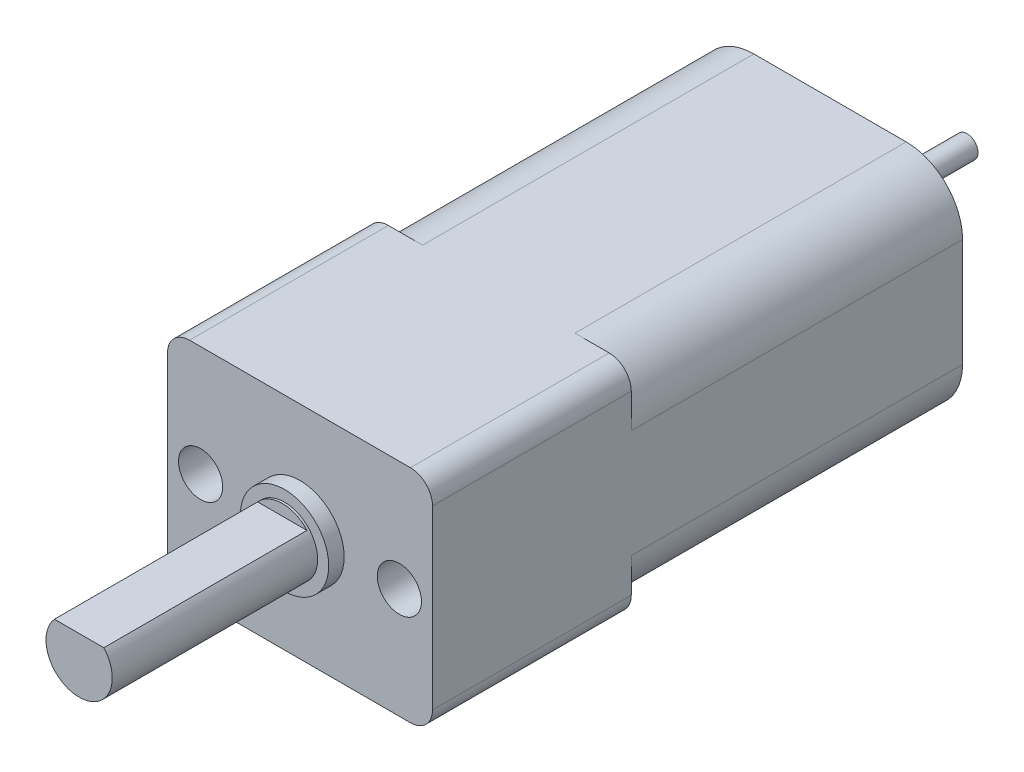
ISO-10303-21;
HEADER;
FILE_DESCRIPTION(('STEP AP214'),'2;1');
FILE_NAME('part.step','',(''),(''),'','','');
FILE_SCHEMA(('AUTOMOTIVE_DESIGN { 1 0 10303 214 1 1 1 1 }'));
ENDSEC;
DATA;
#1=APPLICATION_CONTEXT('core data for automotive mechanical design processes');
#2=APPLICATION_PROTOCOL_DEFINITION('international standard','automotive_design',2000,#1);
#3=PRODUCT_CONTEXT('',#1,'mechanical');
#4=PRODUCT('Part','Part','',(#3));
#5=PRODUCT_RELATED_PRODUCT_CATEGORY('part','',(#4));
#6=PRODUCT_DEFINITION_FORMATION('','',#4);
#7=PRODUCT_DEFINITION_CONTEXT('part definition',#1,'design');
#8=PRODUCT_DEFINITION('design','',#6,#7);
#9=PRODUCT_DEFINITION_SHAPE('','',#8);
#10=(LENGTH_UNIT() NAMED_UNIT(*) SI_UNIT(.MILLI.,.METRE.));
#11=(NAMED_UNIT(*) PLANE_ANGLE_UNIT() SI_UNIT($,.RADIAN.));
#12=(NAMED_UNIT(*) SI_UNIT($,.STERADIAN.) SOLID_ANGLE_UNIT());
#13=UNCERTAINTY_MEASURE_WITH_UNIT(LENGTH_MEASURE(1.E-05),#10,'distance_accuracy_value','');
#14=(GEOMETRIC_REPRESENTATION_CONTEXT(3) GLOBAL_UNCERTAINTY_ASSIGNED_CONTEXT((#13)) GLOBAL_UNIT_ASSIGNED_CONTEXT((#10,
#11,#12)) REPRESENTATION_CONTEXT('',''));
#15=CARTESIAN_POINT('',(0.,0.,0.));
#16=DIRECTION('',(0.,0.,1.));
#17=DIRECTION('',(1.,0.,0.));
#18=AXIS2_PLACEMENT_3D('',#15,#16,#17);
#19=CARTESIAN_POINT('',(0.,0.,-1.2));
#20=DIRECTION('',(0.,0.,-1.));
#21=DIRECTION('',(-1.,0.,0.));
#22=AXIS2_PLACEMENT_3D('',#19,#20,#21);
#23=PLANE('',#22);
#24=CARTESIAN_POINT('',(0.,0.,-1.2));
#25=DIRECTION('',(0.,0.,-1.));
#26=DIRECTION('',(-1.,0.,0.));
#27=AXIS2_PLACEMENT_3D('',#24,#25,#26);
#28=CIRCLE('',#27,2.5);
#29=CARTESIAN_POINT('',(-2.5,0.,-1.2));
#30=VERTEX_POINT('',#29);
#31=EDGE_CURVE('E266',#30,#30,#28,.T.);
#32=ORIENTED_EDGE('',*,*,#31,.T.);
#33=EDGE_LOOP('',(#32));
#34=FACE_BOUND('',#33,.T.);
#35=CARTESIAN_POINT('',(0.,0.,-1.2));
#36=DIRECTION('',(0.,0.,-1.));
#37=DIRECTION('',(-1.,0.,0.));
#38=AXIS2_PLACEMENT_3D('',#35,#36,#37);
#39=CIRCLE('',#38,0.5);
#40=CARTESIAN_POINT('',(-0.5,0.,-1.2));
#41=VERTEX_POINT('',#40);
#42=EDGE_CURVE('E273',#41,#41,#39,.T.);
#43=ORIENTED_EDGE('',*,*,#42,.F.);
#44=EDGE_LOOP('',(#43));
#45=FACE_BOUND('',#44,.T.);
#46=ADVANCED_FACE('F37',(#34,#45),#23,.T.);
#47=CARTESIAN_POINT('',(3.45,2.45,0.));
#48=DIRECTION('',(0.,0.,-1.));
#49=DIRECTION('',(-1.,0.,0.));
#50=AXIS2_PLACEMENT_3D('',#47,#48,#49);
#51=PLANE('',#50);
#52=CARTESIAN_POINT('',(3.45,2.45,0.));
#53=DIRECTION('',(0.,0.,1.));
#54=DIRECTION('',(-1.,0.,0.));
#55=AXIS2_PLACEMENT_3D('',#52,#53,#54);
#56=CIRCLE('',#55,2.55);
#57=CARTESIAN_POINT('',(6.,2.44999999999998,0.));
#58=VERTEX_POINT('',#57);
#59=CARTESIAN_POINT('',(3.44999999999998,5.,0.));
#60=VERTEX_POINT('',#59);
#61=EDGE_CURVE('E195',#58,#60,#56,.T.);
#62=ORIENTED_EDGE('',*,*,#61,.F.);
#63=DIRECTION('',(0.,1.,0.));
#64=VECTOR('',#63,1.);
#65=CARTESIAN_POINT('',(6.,-2.44999999999998,0.));
#66=LINE('',#65,#64);
#67=CARTESIAN_POINT('',(6.,-2.44999999999998,0.));
#68=VERTEX_POINT('',#67);
#69=EDGE_CURVE('E93',#68,#58,#66,.T.);
#70=ORIENTED_EDGE('',*,*,#69,.F.);
#71=CARTESIAN_POINT('',(3.45,-2.45,0.));
#72=DIRECTION('',(0.,0.,1.));
#73=DIRECTION('',(-1.,0.,0.));
#74=AXIS2_PLACEMENT_3D('',#71,#72,#73);
#75=CIRCLE('',#74,2.55);
#76=CARTESIAN_POINT('',(3.44999999999999,-5.,0.));
#77=VERTEX_POINT('',#76);
#78=EDGE_CURVE('E651',#77,#68,#75,.T.);
#79=ORIENTED_EDGE('',*,*,#78,.F.);
#80=DIRECTION('',(1.,0.,0.));
#81=VECTOR('',#80,1.);
#82=CARTESIAN_POINT('',(3.44999999999999,-5.,0.));
#83=LINE('',#82,#81);
#84=CARTESIAN_POINT('',(-3.44999999999998,-5.,0.));
#85=VERTEX_POINT('',#84);
#86=EDGE_CURVE('E653',#85,#77,#83,.T.);
#87=ORIENTED_EDGE('',*,*,#86,.F.);
#88=CARTESIAN_POINT('',(-3.45,-2.45,0.));
#89=DIRECTION('',(0.,0.,1.));
#90=DIRECTION('',(1.,0.,0.));
#91=AXIS2_PLACEMENT_3D('',#88,#89,#90);
#92=CIRCLE('',#91,2.55);
#93=CARTESIAN_POINT('',(-6.,-2.44999999999998,0.));
#94=VERTEX_POINT('',#93);
#95=EDGE_CURVE('E123',#94,#85,#92,.T.);
#96=ORIENTED_EDGE('',*,*,#95,.F.);
#97=DIRECTION('',(0.,-1.,0.));
#98=VECTOR('',#97,1.);
#99=CARTESIAN_POINT('',(-6.,-2.44999999999998,0.));
#100=LINE('',#99,#98);
#101=CARTESIAN_POINT('',(-6.,2.44999999999998,0.));
#102=VERTEX_POINT('',#101);
#103=EDGE_CURVE('E618',#102,#94,#100,.T.);
#104=ORIENTED_EDGE('',*,*,#103,.F.);
#105=CARTESIAN_POINT('',(-3.45,2.45,0.));
#106=DIRECTION('',(0.,0.,1.));
#107=DIRECTION('',(1.,0.,0.));
#108=AXIS2_PLACEMENT_3D('',#105,#106,#107);
#109=CIRCLE('',#108,2.55);
#110=CARTESIAN_POINT('',(-3.44999999999998,5.,0.));
#111=VERTEX_POINT('',#110);
#112=EDGE_CURVE('E657',#111,#102,#109,.T.);
#113=ORIENTED_EDGE('',*,*,#112,.F.);
#114=DIRECTION('',(-1.,0.,0.));
#115=VECTOR('',#114,1.);
#116=CARTESIAN_POINT('',(3.44999999999998,5.,0.));
#117=LINE('',#116,#115);
#118=EDGE_CURVE('E659',#60,#111,#117,.T.);
#119=ORIENTED_EDGE('',*,*,#118,.F.);
#120=EDGE_LOOP('',(#62,#70,#79,#87,#96,#104,#113,#119));
#121=FACE_BOUND('',#120,.T.);
#122=CARTESIAN_POINT('',(0.,0.,0.));
#123=DIRECTION('',(0.,0.,-1.));
#124=DIRECTION('',(-1.,0.,0.));
#125=AXIS2_PLACEMENT_3D('',#122,#123,#124);
#126=CIRCLE('',#125,2.5);
#127=CARTESIAN_POINT('',(-2.5,0.,0.));
#128=VERTEX_POINT('',#127);
#129=EDGE_CURVE('E267',#128,#128,#126,.T.);
#130=ORIENTED_EDGE('',*,*,#129,.F.);
#131=EDGE_LOOP('',(#130));
#132=FACE_BOUND('',#131,.T.);
#133=ADVANCED_FACE('F322',(#121,#132),#51,.T.);
#134=CARTESIAN_POINT('',(0.,0.,24.7));
#135=DIRECTION('',(0.,0.,1.));
#136=DIRECTION('',(1.,0.,0.));
#137=AXIS2_PLACEMENT_3D('',#134,#135,#136);
#138=PLANE('',#137);
#139=CARTESIAN_POINT('',(0.,0.,24.7));
#140=DIRECTION('',(0.,0.,1.));
#141=DIRECTION('',(1.,0.,0.));
#142=AXIS2_PLACEMENT_3D('',#139,#140,#141);
#143=CIRCLE('',#142,2.);
#144=CARTESIAN_POINT('',(2.,0.,24.7));
#145=VERTEX_POINT('',#144);
#146=EDGE_CURVE('E250',#145,#145,#143,.T.);
#147=ORIENTED_EDGE('',*,*,#146,.T.);
#148=EDGE_LOOP('',(#147));
#149=FACE_BOUND('',#148,.T.);
#150=CARTESIAN_POINT('',(0.,0.,24.7));
#151=DIRECTION('',(0.,0.,1.));
#152=DIRECTION('',(1.,0.,0.));
#153=AXIS2_PLACEMENT_3D('',#150,#151,#152);
#154=CIRCLE('',#153,1.5);
#155=CARTESIAN_POINT('',(1.5,0.,24.7));
#156=VERTEX_POINT('',#155);
#157=EDGE_CURVE('E254',#156,#156,#154,.T.);
#158=ORIENTED_EDGE('',*,*,#157,.F.);
#159=EDGE_LOOP('',(#158));
#160=FACE_BOUND('',#159,.T.);
#161=ADVANCED_FACE('F296',(#149,#160),#138,.T.);
#162=CARTESIAN_POINT('',(-5.,-4.,24.));
#163=DIRECTION('',(0.,0.,1.));
#164=DIRECTION('',(1.,0.,0.));
#165=AXIS2_PLACEMENT_3D('',#162,#163,#164);
#166=PLANE('',#165);
#167=CARTESIAN_POINT('',(-4.5,0.,24.));
#168=DIRECTION('',(0.,0.,1.));
#169=DIRECTION('',(1.,0.,0.));
#170=AXIS2_PLACEMENT_3D('',#167,#168,#169);
#171=CIRCLE('',#170,0.999999999999989);
#172=CARTESIAN_POINT('',(-3.50000000000001,0.,24.));
#173=VERTEX_POINT('',#172);
#174=EDGE_CURVE('E287',#173,#173,#171,.T.);
#175=ORIENTED_EDGE('',*,*,#174,.F.);
#176=EDGE_LOOP('',(#175));
#177=FACE_BOUND('',#176,.T.);
#178=CARTESIAN_POINT('',(4.5,0.,24.));
#179=DIRECTION('',(0.,0.,1.));
#180=DIRECTION('',(1.,0.,0.));
#181=AXIS2_PLACEMENT_3D('',#178,#179,#180);
#182=CIRCLE('',#181,0.999999999999989);
#183=CARTESIAN_POINT('',(5.49999999999999,0.,24.));
#184=VERTEX_POINT('',#183);
#185=EDGE_CURVE('E281',#184,#184,#182,.T.);
#186=ORIENTED_EDGE('',*,*,#185,.F.);
#187=EDGE_LOOP('',(#186));
#188=FACE_BOUND('',#187,.T.);
#189=CARTESIAN_POINT('',(-5.,-4.,24.));
#190=DIRECTION('',(0.,0.,1.));
#191=DIRECTION('',(1.,0.,0.));
#192=AXIS2_PLACEMENT_3D('',#189,#190,#191);
#193=CIRCLE('',#192,1.);
#194=CARTESIAN_POINT('',(-6.,-3.99999999999999,24.));
#195=VERTEX_POINT('',#194);
#196=CARTESIAN_POINT('',(-4.99999999999999,-5.,24.));
#197=VERTEX_POINT('',#196);
#198=EDGE_CURVE('E193',#195,#197,#193,.T.);
#199=ORIENTED_EDGE('',*,*,#198,.T.);
#200=DIRECTION('',(1.,0.,0.));
#201=VECTOR('',#200,1.);
#202=CARTESIAN_POINT('',(4.99999999999999,-5.,24.));
#203=LINE('',#202,#201);
#204=CARTESIAN_POINT('',(4.99999999999999,-5.,24.));
#205=VERTEX_POINT('',#204);
#206=EDGE_CURVE('E243',#197,#205,#203,.T.);
#207=ORIENTED_EDGE('',*,*,#206,.T.);
#208=CARTESIAN_POINT('',(5.,-4.,24.));
#209=DIRECTION('',(0.,0.,1.));
#210=DIRECTION('',(1.,0.,0.));
#211=AXIS2_PLACEMENT_3D('',#208,#209,#210);
#212=CIRCLE('',#211,1.);
#213=CARTESIAN_POINT('',(6.,-3.99999999999999,24.));
#214=VERTEX_POINT('',#213);
#215=EDGE_CURVE('E240',#205,#214,#212,.T.);
#216=ORIENTED_EDGE('',*,*,#215,.T.);
#217=DIRECTION('',(0.,1.,0.));
#218=VECTOR('',#217,1.);
#219=CARTESIAN_POINT('',(6.,-3.99999999999999,24.));
#220=LINE('',#219,#218);
#221=CARTESIAN_POINT('',(6.,4.,24.));
#222=VERTEX_POINT('',#221);
#223=EDGE_CURVE('E237',#214,#222,#220,.T.);
#224=ORIENTED_EDGE('',*,*,#223,.T.);
#225=CARTESIAN_POINT('',(5.,4.,24.));
#226=DIRECTION('',(0.,0.,1.));
#227=DIRECTION('',(1.,0.,0.));
#228=AXIS2_PLACEMENT_3D('',#225,#226,#227);
#229=CIRCLE('',#228,1.);
#230=CARTESIAN_POINT('',(4.99999999999999,5.,24.));
#231=VERTEX_POINT('',#230);
#232=EDGE_CURVE('E234',#222,#231,#229,.T.);
#233=ORIENTED_EDGE('',*,*,#232,.T.);
#234=DIRECTION('',(-1.,0.,0.));
#235=VECTOR('',#234,1.);
#236=CARTESIAN_POINT('',(4.99999999999999,5.,24.));
#237=LINE('',#236,#235);
#238=CARTESIAN_POINT('',(-4.99999999999999,5.,24.));
#239=VERTEX_POINT('',#238);
#240=EDGE_CURVE('E229',#231,#239,#237,.T.);
#241=ORIENTED_EDGE('',*,*,#240,.T.);
#242=CARTESIAN_POINT('',(-5.,4.,24.));
#243=DIRECTION('',(0.,0.,1.));
#244=DIRECTION('',(1.,0.,0.));
#245=AXIS2_PLACEMENT_3D('',#242,#243,#244);
#246=CIRCLE('',#245,1.);
#247=CARTESIAN_POINT('',(-6.,3.99999999999999,24.));
#248=VERTEX_POINT('',#247);
#249=EDGE_CURVE('E224',#239,#248,#246,.T.);
#250=ORIENTED_EDGE('',*,*,#249,.T.);
#251=DIRECTION('',(0.,-1.,0.));
#252=VECTOR('',#251,1.);
#253=CARTESIAN_POINT('',(-6.,-3.99999999999999,24.));
#254=LINE('',#253,#252);
#255=EDGE_CURVE('E218',#248,#195,#254,.T.);
#256=ORIENTED_EDGE('',*,*,#255,.T.);
#257=EDGE_LOOP('',(#199,#207,#216,#224,#233,#241,#250,#256));
#258=FACE_BOUND('',#257,.T.);
#259=CARTESIAN_POINT('',(0.,0.,24.));
#260=DIRECTION('',(0.,0.,1.));
#261=DIRECTION('',(1.,0.,0.));
#262=AXIS2_PLACEMENT_3D('',#259,#260,#261);
#263=CIRCLE('',#262,2.);
#264=CARTESIAN_POINT('',(2.,0.,24.));
#265=VERTEX_POINT('',#264);
#266=EDGE_CURVE('E247',#265,#265,#263,.T.);
#267=ORIENTED_EDGE('',*,*,#266,.F.);
#268=EDGE_LOOP('',(#267));
#269=FACE_BOUND('',#268,.T.);
#270=ADVANCED_FACE('F293',(#177,#188,#258,#269),#166,.T.);
#271=CARTESIAN_POINT('',(3.45,2.45,15.));
#272=DIRECTION('',(0.,0.,-1.));
#273=DIRECTION('',(-1.,0.,0.));
#274=AXIS2_PLACEMENT_3D('',#271,#272,#273);
#275=CYLINDRICAL_SURFACE('',#274,2.55);
#276=ORIENTED_EDGE('',*,*,#61,.T.);
#277=DIRECTION('',(0.,0.,-1.));
#278=VECTOR('',#277,1.);
#279=CARTESIAN_POINT('',(3.44999999999998,5.,15.));
#280=LINE('',#279,#278);
#281=CARTESIAN_POINT('',(3.44999999999998,5.,15.));
#282=VERTEX_POINT('',#281);
#283=EDGE_CURVE('E100',#282,#60,#280,.T.);
#284=ORIENTED_EDGE('',*,*,#283,.F.);
#285=CARTESIAN_POINT('',(3.45,2.45,15.));
#286=DIRECTION('',(0.,0.,1.));
#287=DIRECTION('',(-1.,0.,0.));
#288=AXIS2_PLACEMENT_3D('',#285,#286,#287);
#289=CIRCLE('',#288,2.55);
#290=CARTESIAN_POINT('',(6.,2.44999999999998,15.));
#291=VERTEX_POINT('',#290);
#292=EDGE_CURVE('E630',#291,#282,#289,.T.);
#293=ORIENTED_EDGE('',*,*,#292,.F.);
#294=DIRECTION('',(0.,0.,-1.));
#295=VECTOR('',#294,1.);
#296=CARTESIAN_POINT('',(6.,2.44999999999998,15.));
#297=LINE('',#296,#295);
#298=EDGE_CURVE('E61',#291,#58,#297,.T.);
#299=ORIENTED_EDGE('',*,*,#298,.T.);
#300=EDGE_LOOP('',(#276,#284,#293,#299));
#301=FACE_BOUND('',#300,.T.);
#302=ADVANCED_FACE('F39',(#301),#275,.T.);
#303=CARTESIAN_POINT('',(3.44999999999998,5.,15.));
#304=DIRECTION('',(0.,-1.,0.));
#305=DIRECTION('',(1.,0.,0.));
#306=AXIS2_PLACEMENT_3D('',#303,#304,#305);
#307=PLANE('',#306);
#308=ORIENTED_EDGE('',*,*,#118,.T.);
#309=DIRECTION('',(0.,0.,-1.));
#310=VECTOR('',#309,1.);
#311=CARTESIAN_POINT('',(-3.44999999999998,5.,15.));
#312=LINE('',#311,#310);
#313=CARTESIAN_POINT('',(-3.44999999999998,5.,15.));
#314=VERTEX_POINT('',#313);
#315=EDGE_CURVE('E621',#314,#111,#312,.T.);
#316=ORIENTED_EDGE('',*,*,#315,.F.);
#317=DIRECTION('',(-1.,0.,0.));
#318=VECTOR('',#317,1.);
#319=CARTESIAN_POINT('',(4.99999999999999,5.,15.));
#320=LINE('',#319,#318);
#321=CARTESIAN_POINT('',(-4.99999999999999,5.,15.));
#322=VERTEX_POINT('',#321);
#323=EDGE_CURVE('E173',#314,#322,#320,.T.);
#324=ORIENTED_EDGE('',*,*,#323,.T.);
#325=DIRECTION('',(0.,0.,-1.));
#326=VECTOR('',#325,1.);
#327=CARTESIAN_POINT('',(-4.99999999999999,5.,24.));
#328=LINE('',#327,#326);
#329=EDGE_CURVE('E208',#239,#322,#328,.T.);
#330=ORIENTED_EDGE('',*,*,#329,.F.);
#331=ORIENTED_EDGE('',*,*,#240,.F.);
#332=DIRECTION('',(0.,0.,-1.));
#333=VECTOR('',#332,1.);
#334=CARTESIAN_POINT('',(4.99999999999999,5.,24.));
#335=LINE('',#334,#333);
#336=CARTESIAN_POINT('',(4.99999999999999,5.,15.));
#337=VERTEX_POINT('',#336);
#338=EDGE_CURVE('E205',#231,#337,#335,.T.);
#339=ORIENTED_EDGE('',*,*,#338,.T.);
#340=EDGE_CURVE('E176',#337,#282,#320,.T.);
#341=ORIENTED_EDGE('',*,*,#340,.T.);
#342=ORIENTED_EDGE('',*,*,#283,.T.);
#343=EDGE_LOOP('',(#308,#316,#324,#330,#331,#339,#341,#342));
#344=FACE_BOUND('',#343,.T.);
#345=ADVANCED_FACE('F370',(#344),#307,.F.);
#346=CARTESIAN_POINT('',(-3.45,2.45,15.));
#347=DIRECTION('',(0.,0.,-1.));
#348=DIRECTION('',(-1.,0.,0.));
#349=AXIS2_PLACEMENT_3D('',#346,#347,#348);
#350=CYLINDRICAL_SURFACE('',#349,2.55);
#351=ORIENTED_EDGE('',*,*,#112,.T.);
#352=DIRECTION('',(0.,0.,-1.));
#353=VECTOR('',#352,1.);
#354=CARTESIAN_POINT('',(-6.,2.44999999999998,15.));
#355=LINE('',#354,#353);
#356=CARTESIAN_POINT('',(-6.,2.44999999999998,15.));
#357=VERTEX_POINT('',#356);
#358=EDGE_CURVE('E619',#357,#102,#355,.T.);
#359=ORIENTED_EDGE('',*,*,#358,.F.);
#360=CARTESIAN_POINT('',(-3.45,2.45,15.));
#361=DIRECTION('',(0.,0.,1.));
#362=DIRECTION('',(1.,0.,0.));
#363=AXIS2_PLACEMENT_3D('',#360,#361,#362);
#364=CIRCLE('',#363,2.55);
#365=EDGE_CURVE('E140',#314,#357,#364,.T.);
#366=ORIENTED_EDGE('',*,*,#365,.F.);
#367=ORIENTED_EDGE('',*,*,#315,.T.);
#368=EDGE_LOOP('',(#351,#359,#366,#367));
#369=FACE_BOUND('',#368,.T.);
#370=ADVANCED_FACE('F376',(#369),#350,.T.);
#371=CARTESIAN_POINT('',(-6.,-2.44999999999998,15.));
#372=DIRECTION('',(1.,0.,0.));
#373=DIRECTION('',(0.,0.,-1.));
#374=AXIS2_PLACEMENT_3D('',#371,#372,#373);
#375=PLANE('',#374);
#376=ORIENTED_EDGE('',*,*,#103,.T.);
#377=DIRECTION('',(0.,0.,-1.));
#378=VECTOR('',#377,1.);
#379=CARTESIAN_POINT('',(-6.,-2.44999999999998,15.));
#380=LINE('',#379,#378);
#381=CARTESIAN_POINT('',(-6.,-2.44999999999998,15.));
#382=VERTEX_POINT('',#381);
#383=EDGE_CURVE('E127',#382,#94,#380,.T.);
#384=ORIENTED_EDGE('',*,*,#383,.F.);
#385=DIRECTION('',(0.,-1.,0.));
#386=VECTOR('',#385,1.);
#387=CARTESIAN_POINT('',(-6.,-3.99999999999999,15.));
#388=LINE('',#387,#386);
#389=CARTESIAN_POINT('',(-6.,-3.99999999999999,15.));
#390=VERTEX_POINT('',#389);
#391=EDGE_CURVE('E138',#382,#390,#388,.T.);
#392=ORIENTED_EDGE('',*,*,#391,.T.);
#393=DIRECTION('',(0.,0.,-1.));
#394=VECTOR('',#393,1.);
#395=CARTESIAN_POINT('',(-6.,-3.99999999999999,24.));
#396=LINE('',#395,#394);
#397=EDGE_CURVE('E186',#195,#390,#396,.T.);
#398=ORIENTED_EDGE('',*,*,#397,.F.);
#399=ORIENTED_EDGE('',*,*,#255,.F.);
#400=DIRECTION('',(0.,0.,-1.));
#401=VECTOR('',#400,1.);
#402=CARTESIAN_POINT('',(-6.,3.99999999999999,24.));
#403=LINE('',#402,#401);
#404=CARTESIAN_POINT('',(-6.,3.99999999999999,15.));
#405=VERTEX_POINT('',#404);
#406=EDGE_CURVE('E210',#248,#405,#403,.T.);
#407=ORIENTED_EDGE('',*,*,#406,.T.);
#408=EDGE_CURVE('E190',#405,#357,#388,.T.);
#409=ORIENTED_EDGE('',*,*,#408,.T.);
#410=ORIENTED_EDGE('',*,*,#358,.T.);
#411=EDGE_LOOP('',(#376,#384,#392,#398,#399,#407,#409,#410));
#412=FACE_BOUND('',#411,.T.);
#413=ADVANCED_FACE('F383',(#412),#375,.F.);
#414=CARTESIAN_POINT('',(-3.45,-2.45,15.));
#415=DIRECTION('',(0.,0.,-1.));
#416=DIRECTION('',(-1.,0.,0.));
#417=AXIS2_PLACEMENT_3D('',#414,#415,#416);
#418=CYLINDRICAL_SURFACE('',#417,2.55);
#419=ORIENTED_EDGE('',*,*,#95,.T.);
#420=DIRECTION('',(0.,0.,-1.));
#421=VECTOR('',#420,1.);
#422=CARTESIAN_POINT('',(-3.44999999999998,-5.,15.));
#423=LINE('',#422,#421);
#424=CARTESIAN_POINT('',(-3.44999999999998,-5.,15.));
#425=VERTEX_POINT('',#424);
#426=EDGE_CURVE('E116',#425,#85,#423,.T.);
#427=ORIENTED_EDGE('',*,*,#426,.F.);
#428=CARTESIAN_POINT('',(-3.45,-2.45,15.));
#429=DIRECTION('',(0.,0.,1.));
#430=DIRECTION('',(1.,0.,0.));
#431=AXIS2_PLACEMENT_3D('',#428,#429,#430);
#432=CIRCLE('',#431,2.55);
#433=EDGE_CURVE('E120',#382,#425,#432,.T.);
#434=ORIENTED_EDGE('',*,*,#433,.F.);
#435=ORIENTED_EDGE('',*,*,#383,.T.);
#436=EDGE_LOOP('',(#419,#427,#434,#435));
#437=FACE_BOUND('',#436,.T.);
#438=ADVANCED_FACE('F118',(#437),#418,.T.);
#439=CARTESIAN_POINT('',(3.44999999999999,-5.,15.));
#440=DIRECTION('',(0.,1.,0.));
#441=DIRECTION('',(-1.,0.,0.));
#442=AXIS2_PLACEMENT_3D('',#439,#440,#441);
#443=PLANE('',#442);
#444=ORIENTED_EDGE('',*,*,#86,.T.);
#445=DIRECTION('',(0.,0.,-1.));
#446=VECTOR('',#445,1.);
#447=CARTESIAN_POINT('',(3.44999999999999,-5.,15.));
#448=LINE('',#447,#446);
#449=CARTESIAN_POINT('',(3.44999999999999,-5.,15.));
#450=VERTEX_POINT('',#449);
#451=EDGE_CURVE('E128',#450,#77,#448,.T.);
#452=ORIENTED_EDGE('',*,*,#451,.F.);
#453=DIRECTION('',(1.,0.,0.));
#454=VECTOR('',#453,1.);
#455=CARTESIAN_POINT('',(4.99999999999999,-5.,15.));
#456=LINE('',#455,#454);
#457=CARTESIAN_POINT('',(4.99999999999999,-5.,15.));
#458=VERTEX_POINT('',#457);
#459=EDGE_CURVE('E148',#450,#458,#456,.T.);
#460=ORIENTED_EDGE('',*,*,#459,.T.);
#461=DIRECTION('',(0.,0.,-1.));
#462=VECTOR('',#461,1.);
#463=CARTESIAN_POINT('',(4.99999999999999,-5.,24.));
#464=LINE('',#463,#462);
#465=EDGE_CURVE('E196',#205,#458,#464,.T.);
#466=ORIENTED_EDGE('',*,*,#465,.F.);
#467=ORIENTED_EDGE('',*,*,#206,.F.);
#468=DIRECTION('',(0.,0.,-1.));
#469=VECTOR('',#468,1.);
#470=CARTESIAN_POINT('',(-4.99999999999999,-5.,24.));
#471=LINE('',#470,#469);
#472=CARTESIAN_POINT('',(-4.99999999999999,-5.,15.));
#473=VERTEX_POINT('',#472);
#474=EDGE_CURVE('E145',#197,#473,#471,.T.);
#475=ORIENTED_EDGE('',*,*,#474,.T.);
#476=EDGE_CURVE('E135',#473,#425,#456,.T.);
#477=ORIENTED_EDGE('',*,*,#476,.T.);
#478=ORIENTED_EDGE('',*,*,#426,.T.);
#479=EDGE_LOOP('',(#444,#452,#460,#466,#467,#475,#477,#478));
#480=FACE_BOUND('',#479,.T.);
#481=ADVANCED_FACE('F142',(#480),#443,.F.);
#482=CARTESIAN_POINT('',(3.45,-2.45,15.));
#483=DIRECTION('',(0.,0.,-1.));
#484=DIRECTION('',(-1.,0.,0.));
#485=AXIS2_PLACEMENT_3D('',#482,#483,#484);
#486=CYLINDRICAL_SURFACE('',#485,2.55);
#487=ORIENTED_EDGE('',*,*,#78,.T.);
#488=DIRECTION('',(0.,0.,-1.));
#489=VECTOR('',#488,1.);
#490=CARTESIAN_POINT('',(6.,-2.44999999999998,15.));
#491=LINE('',#490,#489);
#492=CARTESIAN_POINT('',(6.,-2.45,15.));
#493=VERTEX_POINT('',#492);
#494=EDGE_CURVE('E644',#493,#68,#491,.T.);
#495=ORIENTED_EDGE('',*,*,#494,.F.);
#496=CARTESIAN_POINT('',(3.45,-2.45,15.));
#497=DIRECTION('',(0.,0.,1.));
#498=DIRECTION('',(-1.,0.,0.));
#499=AXIS2_PLACEMENT_3D('',#496,#497,#498);
#500=CIRCLE('',#499,2.55);
#501=EDGE_CURVE('E139',#450,#493,#500,.T.);
#502=ORIENTED_EDGE('',*,*,#501,.F.);
#503=ORIENTED_EDGE('',*,*,#451,.T.);
#504=EDGE_LOOP('',(#487,#495,#502,#503));
#505=FACE_BOUND('',#504,.T.);
#506=ADVANCED_FACE('F403',(#505),#486,.T.);
#507=CARTESIAN_POINT('',(6.,-2.44999999999998,15.));
#508=DIRECTION('',(-1.,0.,0.));
#509=DIRECTION('',(0.,0.,1.));
#510=AXIS2_PLACEMENT_3D('',#507,#508,#509);
#511=PLANE('',#510);
#512=ORIENTED_EDGE('',*,*,#69,.T.);
#513=ORIENTED_EDGE('',*,*,#298,.F.);
#514=DIRECTION('',(0.,1.,0.));
#515=VECTOR('',#514,1.);
#516=CARTESIAN_POINT('',(6.,-3.99999999999999,15.));
#517=LINE('',#516,#515);
#518=CARTESIAN_POINT('',(6.,4.,15.));
#519=VERTEX_POINT('',#518);
#520=EDGE_CURVE('E151',#291,#519,#517,.T.);
#521=ORIENTED_EDGE('',*,*,#520,.T.);
#522=DIRECTION('',(0.,0.,-1.));
#523=VECTOR('',#522,1.);
#524=CARTESIAN_POINT('',(6.,4.,24.));
#525=LINE('',#524,#523);
#526=EDGE_CURVE('E202',#222,#519,#525,.T.);
#527=ORIENTED_EDGE('',*,*,#526,.F.);
#528=ORIENTED_EDGE('',*,*,#223,.F.);
#529=DIRECTION('',(0.,0.,-1.));
#530=VECTOR('',#529,1.);
#531=CARTESIAN_POINT('',(6.,-3.99999999999999,24.));
#532=LINE('',#531,#530);
#533=CARTESIAN_POINT('',(6.,-3.99999999999999,15.));
#534=VERTEX_POINT('',#533);
#535=EDGE_CURVE('E199',#214,#534,#532,.T.);
#536=ORIENTED_EDGE('',*,*,#535,.T.);
#537=EDGE_CURVE('E170',#534,#493,#517,.T.);
#538=ORIENTED_EDGE('',*,*,#537,.T.);
#539=ORIENTED_EDGE('',*,*,#494,.T.);
#540=EDGE_LOOP('',(#512,#513,#521,#527,#528,#536,#538,#539));
#541=FACE_BOUND('',#540,.T.);
#542=ADVANCED_FACE('F410',(#541),#511,.F.);
#543=CARTESIAN_POINT('',(-5.,-4.,15.));
#544=DIRECTION('',(0.,0.,1.));
#545=DIRECTION('',(1.,0.,0.));
#546=AXIS2_PLACEMENT_3D('',#543,#544,#545);
#547=PLANE('',#546);
#548=ORIENTED_EDGE('',*,*,#520,.F.);
#549=ORIENTED_EDGE('',*,*,#292,.T.);
#550=ORIENTED_EDGE('',*,*,#340,.F.);
#551=CARTESIAN_POINT('',(5.,4.,15.));
#552=DIRECTION('',(0.,0.,1.));
#553=DIRECTION('',(1.,0.,0.));
#554=AXIS2_PLACEMENT_3D('',#551,#552,#553);
#555=CIRCLE('',#554,1.);
#556=EDGE_CURVE('E167',#519,#337,#555,.T.);
#557=ORIENTED_EDGE('',*,*,#556,.F.);
#558=EDGE_LOOP('',(#548,#549,#550,#557));
#559=FACE_BOUND('',#558,.T.);
#560=ADVANCED_FACE('F418',(#559),#547,.F.);
#561=ORIENTED_EDGE('',*,*,#323,.F.);
#562=ORIENTED_EDGE('',*,*,#365,.T.);
#563=ORIENTED_EDGE('',*,*,#408,.F.);
#564=CARTESIAN_POINT('',(-5.,4.,15.));
#565=DIRECTION('',(0.,0.,1.));
#566=DIRECTION('',(1.,0.,0.));
#567=AXIS2_PLACEMENT_3D('',#564,#565,#566);
#568=CIRCLE('',#567,1.);
#569=EDGE_CURVE('E180',#322,#405,#568,.T.);
#570=ORIENTED_EDGE('',*,*,#569,.F.);
#571=EDGE_LOOP('',(#561,#562,#563,#570));
#572=FACE_BOUND('',#571,.T.);
#573=ADVANCED_FACE('F425',(#572),#547,.F.);
#574=ORIENTED_EDGE('',*,*,#391,.F.);
#575=ORIENTED_EDGE('',*,*,#433,.T.);
#576=ORIENTED_EDGE('',*,*,#476,.F.);
#577=CARTESIAN_POINT('',(-5.,-4.,15.));
#578=DIRECTION('',(0.,0.,1.));
#579=DIRECTION('',(1.,0.,0.));
#580=AXIS2_PLACEMENT_3D('',#577,#578,#579);
#581=CIRCLE('',#580,1.);
#582=EDGE_CURVE('E154',#390,#473,#581,.T.);
#583=ORIENTED_EDGE('',*,*,#582,.F.);
#584=EDGE_LOOP('',(#574,#575,#576,#583));
#585=FACE_BOUND('',#584,.T.);
#586=ADVANCED_FACE('F132',(#585),#547,.F.);
#587=ORIENTED_EDGE('',*,*,#459,.F.);
#588=ORIENTED_EDGE('',*,*,#501,.T.);
#589=ORIENTED_EDGE('',*,*,#537,.F.);
#590=CARTESIAN_POINT('',(5.,-4.,15.));
#591=DIRECTION('',(0.,0.,1.));
#592=DIRECTION('',(1.,0.,0.));
#593=AXIS2_PLACEMENT_3D('',#590,#591,#592);
#594=CIRCLE('',#593,1.);
#595=EDGE_CURVE('E147',#458,#534,#594,.T.);
#596=ORIENTED_EDGE('',*,*,#595,.F.);
#597=EDGE_LOOP('',(#587,#588,#589,#596));
#598=FACE_BOUND('',#597,.T.);
#599=ADVANCED_FACE('F428',(#598),#547,.F.);
#600=CARTESIAN_POINT('',(-5.,-4.,24.));
#601=DIRECTION('',(0.,0.,-1.));
#602=DIRECTION('',(-1.,0.,0.));
#603=AXIS2_PLACEMENT_3D('',#600,#601,#602);
#604=CYLINDRICAL_SURFACE('',#603,1.);
#605=ORIENTED_EDGE('',*,*,#582,.T.);
#606=ORIENTED_EDGE('',*,*,#474,.F.);
#607=ORIENTED_EDGE('',*,*,#198,.F.);
#608=ORIENTED_EDGE('',*,*,#397,.T.);
#609=EDGE_LOOP('',(#605,#606,#607,#608));
#610=FACE_BOUND('',#609,.T.);
#611=ADVANCED_FACE('F445',(#610),#604,.T.);
#612=CARTESIAN_POINT('',(5.,-4.,24.));
#613=DIRECTION('',(0.,0.,-1.));
#614=DIRECTION('',(-1.,0.,0.));
#615=AXIS2_PLACEMENT_3D('',#612,#613,#614);
#616=CYLINDRICAL_SURFACE('',#615,1.);
#617=ORIENTED_EDGE('',*,*,#595,.T.);
#618=ORIENTED_EDGE('',*,*,#535,.F.);
#619=ORIENTED_EDGE('',*,*,#215,.F.);
#620=ORIENTED_EDGE('',*,*,#465,.T.);
#621=EDGE_LOOP('',(#617,#618,#619,#620));
#622=FACE_BOUND('',#621,.T.);
#623=ADVANCED_FACE('F452',(#622),#616,.T.);
#624=CARTESIAN_POINT('',(5.,4.,24.));
#625=DIRECTION('',(0.,0.,-1.));
#626=DIRECTION('',(-1.,0.,0.));
#627=AXIS2_PLACEMENT_3D('',#624,#625,#626);
#628=CYLINDRICAL_SURFACE('',#627,1.);
#629=ORIENTED_EDGE('',*,*,#556,.T.);
#630=ORIENTED_EDGE('',*,*,#338,.F.);
#631=ORIENTED_EDGE('',*,*,#232,.F.);
#632=ORIENTED_EDGE('',*,*,#526,.T.);
#633=EDGE_LOOP('',(#629,#630,#631,#632));
#634=FACE_BOUND('',#633,.T.);
#635=ADVANCED_FACE('F316',(#634),#628,.T.);
#636=CARTESIAN_POINT('',(-5.,4.,24.));
#637=DIRECTION('',(0.,0.,-1.));
#638=DIRECTION('',(-1.,0.,0.));
#639=AXIS2_PLACEMENT_3D('',#636,#637,#638);
#640=CYLINDRICAL_SURFACE('',#639,1.);
#641=ORIENTED_EDGE('',*,*,#569,.T.);
#642=ORIENTED_EDGE('',*,*,#406,.F.);
#643=ORIENTED_EDGE('',*,*,#249,.F.);
#644=ORIENTED_EDGE('',*,*,#329,.T.);
#645=EDGE_LOOP('',(#641,#642,#643,#644));
#646=FACE_BOUND('',#645,.T.);
#647=ADVANCED_FACE('F306',(#646),#640,.T.);
#648=CARTESIAN_POINT('',(0.,0.,24.7));
#649=DIRECTION('',(0.,0.,-1.));
#650=DIRECTION('',(-1.,0.,0.));
#651=AXIS2_PLACEMENT_3D('',#648,#649,#650);
#652=CYLINDRICAL_SURFACE('',#651,2.);
#653=ORIENTED_EDGE('',*,*,#146,.F.);
#654=EDGE_LOOP('',(#653));
#655=FACE_BOUND('',#654,.T.);
#656=ORIENTED_EDGE('',*,*,#266,.T.);
#657=EDGE_LOOP('',(#656));
#658=FACE_BOUND('',#657,.T.);
#659=ADVANCED_FACE('F303',(#655,#658),#652,.T.);
#660=CARTESIAN_POINT('',(0.,0.,34.));
#661=DIRECTION('',(0.,0.,-1.));
#662=DIRECTION('',(-1.,0.,0.));
#663=AXIS2_PLACEMENT_3D('',#660,#661,#662);
#664=CYLINDRICAL_SURFACE('',#663,1.5);
#665=CARTESIAN_POINT('',(0.,0.,34.));
#666=DIRECTION('',(0.,0.,1.));
#667=DIRECTION('',(1.,0.,0.));
#668=AXIS2_PLACEMENT_3D('',#665,#666,#667);
#669=CIRCLE('',#668,1.5);
#670=CARTESIAN_POINT('',(-1.1180339887499,1.,34.));
#671=VERTEX_POINT('',#670);
#672=CARTESIAN_POINT('',(1.11803398874989,1.,34.));
#673=VERTEX_POINT('',#672);
#674=EDGE_CURVE('E251',#671,#673,#669,.T.);
#675=ORIENTED_EDGE('',*,*,#674,.F.);
#676=DIRECTION('',(0.,0.,-1.));
#677=VECTOR('',#676,1.);
#678=CARTESIAN_POINT('',(-1.1180339887499,1.,34.));
#679=LINE('',#678,#677);
#680=CARTESIAN_POINT('',(-1.1180339887499,1.,24.8));
#681=VERTEX_POINT('',#680);
#682=EDGE_CURVE('E52',#671,#681,#679,.T.);
#683=ORIENTED_EDGE('',*,*,#682,.T.);
#684=CARTESIAN_POINT('',(0.,0.,24.8));
#685=DIRECTION('',(0.,0.,1.));
#686=DIRECTION('',(1.,0.,0.));
#687=AXIS2_PLACEMENT_3D('',#684,#685,#686);
#688=CIRCLE('',#687,1.5);
#689=CARTESIAN_POINT('',(1.11803398874989,1.,24.8));
#690=VERTEX_POINT('',#689);
#691=EDGE_CURVE('E11',#690,#681,#688,.T.);
#692=ORIENTED_EDGE('',*,*,#691,.F.);
#693=DIRECTION('',(0.,0.,-1.));
#694=VECTOR('',#693,1.);
#695=CARTESIAN_POINT('',(1.11803398874989,1.,34.));
#696=LINE('',#695,#694);
#697=EDGE_CURVE('E260',#690,#673,#696,.F.);
#698=ORIENTED_EDGE('',*,*,#697,.T.);
#699=EDGE_LOOP('',(#675,#683,#692,#698));
#700=FACE_BOUND('',#699,.T.);
#701=ORIENTED_EDGE('',*,*,#157,.T.);
#702=EDGE_LOOP('',(#701));
#703=FACE_BOUND('',#702,.T.);
#704=ADVANCED_FACE('F305',(#700,#703),#664,.T.);
#705=CARTESIAN_POINT('',(0.,0.,34.));
#706=DIRECTION('',(0.,0.,1.));
#707=DIRECTION('',(1.,0.,0.));
#708=AXIS2_PLACEMENT_3D('',#705,#706,#707);
#709=PLANE('',#708);
#710=DIRECTION('',(1.,0.,0.));
#711=VECTOR('',#710,1.);
#712=CARTESIAN_POINT('',(0.,1.,34.));
#713=LINE('',#712,#711);
#714=EDGE_CURVE('E45',#671,#673,#713,.T.);
#715=ORIENTED_EDGE('',*,*,#714,.F.);
#716=ORIENTED_EDGE('',*,*,#674,.T.);
#717=EDGE_LOOP('',(#715,#716));
#718=FACE_BOUND('',#717,.T.);
#719=ADVANCED_FACE('F313',(#718),#709,.T.);
#720=CARTESIAN_POINT('',(0.,0.,24.8));
#721=DIRECTION('',(0.,0.,1.));
#722=DIRECTION('',(1.,0.,0.));
#723=AXIS2_PLACEMENT_3D('',#720,#721,#722);
#724=PLANE('',#723);
#725=ORIENTED_EDGE('',*,*,#691,.T.);
#726=DIRECTION('',(1.,0.,0.));
#727=VECTOR('',#726,1.);
#728=CARTESIAN_POINT('',(1.5,1.,24.8));
#729=LINE('',#728,#727);
#730=EDGE_CURVE('E263',#681,#690,#729,.T.);
#731=ORIENTED_EDGE('',*,*,#730,.T.);
#732=EDGE_LOOP('',(#725,#731));
#733=FACE_BOUND('',#732,.T.);
#734=ADVANCED_FACE('F340',(#733),#724,.T.);
#735=CARTESIAN_POINT('',(1.5,1.,24.8));
#736=DIRECTION('',(0.,-1.,0.));
#737=DIRECTION('',(1.,0.,0.));
#738=AXIS2_PLACEMENT_3D('',#735,#736,#737);
#739=PLANE('',#738);
#740=ORIENTED_EDGE('',*,*,#714,.T.);
#741=ORIENTED_EDGE('',*,*,#697,.F.);
#742=ORIENTED_EDGE('',*,*,#730,.F.);
#743=ORIENTED_EDGE('',*,*,#682,.F.);
#744=EDGE_LOOP('',(#740,#741,#742,#743));
#745=FACE_BOUND('',#744,.T.);
#746=ADVANCED_FACE('F338',(#745),#739,.F.);
#747=CARTESIAN_POINT('',(0.,0.,-1.2));
#748=DIRECTION('',(0.,0.,1.));
#749=DIRECTION('',(1.,0.,0.));
#750=AXIS2_PLACEMENT_3D('',#747,#748,#749);
#751=CYLINDRICAL_SURFACE('',#750,2.5);
#752=ORIENTED_EDGE('',*,*,#31,.F.);
#753=EDGE_LOOP('',(#752));
#754=FACE_BOUND('',#753,.T.);
#755=ORIENTED_EDGE('',*,*,#129,.T.);
#756=EDGE_LOOP('',(#755));
#757=FACE_BOUND('',#756,.T.);
#758=ADVANCED_FACE('F335',(#754,#757),#751,.T.);
#759=CARTESIAN_POINT('',(0.,0.,-6.2));
#760=DIRECTION('',(0.,0.,1.));
#761=DIRECTION('',(1.,0.,0.));
#762=AXIS2_PLACEMENT_3D('',#759,#760,#761);
#763=CYLINDRICAL_SURFACE('',#762,0.5);
#764=CARTESIAN_POINT('',(0.,0.,-6.2));
#765=DIRECTION('',(0.,0.,-1.));
#766=DIRECTION('',(-1.,0.,0.));
#767=AXIS2_PLACEMENT_3D('',#764,#765,#766);
#768=CIRCLE('',#767,0.5);
#769=CARTESIAN_POINT('',(-0.5,0.,-6.2));
#770=VERTEX_POINT('',#769);
#771=EDGE_CURVE('E270',#770,#770,#768,.T.);
#772=ORIENTED_EDGE('',*,*,#771,.F.);
#773=EDGE_LOOP('',(#772));
#774=FACE_BOUND('',#773,.T.);
#775=ORIENTED_EDGE('',*,*,#42,.T.);
#776=EDGE_LOOP('',(#775));
#777=FACE_BOUND('',#776,.T.);
#778=ADVANCED_FACE('F333',(#774,#777),#763,.T.);
#779=CARTESIAN_POINT('',(0.,0.,-6.2));
#780=DIRECTION('',(0.,0.,-1.));
#781=DIRECTION('',(-1.,0.,0.));
#782=AXIS2_PLACEMENT_3D('',#779,#780,#781);
#783=PLANE('',#782);
#784=ORIENTED_EDGE('',*,*,#771,.T.);
#785=EDGE_LOOP('',(#784));
#786=FACE_BOUND('',#785,.T.);
#787=ADVANCED_FACE('F521',(#786),#783,.T.);
#788=CARTESIAN_POINT('',(4.5,0.,17.));
#789=DIRECTION('',(0.,0.,1.));
#790=DIRECTION('',(1.,0.,0.));
#791=AXIS2_PLACEMENT_3D('',#788,#789,#790);
#792=CONICAL_SURFACE('',#791,0.999999999999998,1.02974425867665);
#793=CARTESIAN_POINT('',(4.5,0.,16.3991393809724));
#794=VERTEX_POINT('',#793);
#795=VERTEX_LOOP('',#794);
#796=FACE_BOUND('',#795,.T.);
#797=CARTESIAN_POINT('',(4.5,0.,17.));
#798=DIRECTION('',(0.,0.,1.));
#799=DIRECTION('',(1.,0.,0.));
#800=AXIS2_PLACEMENT_3D('',#797,#798,#799);
#801=CIRCLE('',#800,0.999999999999998);
#802=CARTESIAN_POINT('',(5.5,0.,17.));
#803=VERTEX_POINT('',#802);
#804=EDGE_CURVE('E276',#803,#803,#801,.T.);
#805=ORIENTED_EDGE('',*,*,#804,.T.);
#806=EDGE_LOOP('',(#805));
#807=FACE_BOUND('',#806,.T.);
#808=ADVANCED_FACE('F528',(#796,#807),#792,.F.);
#809=CARTESIAN_POINT('',(4.5,0.,24.));
#810=DIRECTION('',(0.,0.,1.));
#811=DIRECTION('',(1.,0.,0.));
#812=AXIS2_PLACEMENT_3D('',#809,#810,#811);
#813=CYLINDRICAL_SURFACE('',#812,0.999999999999994);
#814=ORIENTED_EDGE('',*,*,#804,.F.);
#815=EDGE_LOOP('',(#814));
#816=FACE_BOUND('',#815,.T.);
#817=ORIENTED_EDGE('',*,*,#185,.T.);
#818=EDGE_LOOP('',(#817));
#819=FACE_BOUND('',#818,.T.);
#820=ADVANCED_FACE('F535',(#816,#819),#813,.F.);
#821=CARTESIAN_POINT('',(-4.5,0.,17.));
#822=DIRECTION('',(0.,0.,1.));
#823=DIRECTION('',(1.,0.,0.));
#824=AXIS2_PLACEMENT_3D('',#821,#822,#823);
#825=CONICAL_SURFACE('',#824,0.999999999999998,1.02974425867665);
#826=CARTESIAN_POINT('',(-4.5,0.,16.3991393809724));
#827=VERTEX_POINT('',#826);
#828=VERTEX_LOOP('',#827);
#829=FACE_BOUND('',#828,.T.);
#830=CARTESIAN_POINT('',(-4.5,0.,17.));
#831=DIRECTION('',(0.,0.,1.));
#832=DIRECTION('',(1.,0.,0.));
#833=AXIS2_PLACEMENT_3D('',#830,#831,#832);
#834=CIRCLE('',#833,0.999999999999998);
#835=CARTESIAN_POINT('',(-3.5,0.,17.));
#836=VERTEX_POINT('',#835);
#837=EDGE_CURVE('E284',#836,#836,#834,.T.);
#838=ORIENTED_EDGE('',*,*,#837,.T.);
#839=EDGE_LOOP('',(#838));
#840=FACE_BOUND('',#839,.T.);
#841=ADVANCED_FACE('F544',(#829,#840),#825,.F.);
#842=CARTESIAN_POINT('',(-4.5,0.,24.));
#843=DIRECTION('',(0.,0.,1.));
#844=DIRECTION('',(1.,0.,0.));
#845=AXIS2_PLACEMENT_3D('',#842,#843,#844);
#846=CYLINDRICAL_SURFACE('',#845,0.999999999999993);
#847=ORIENTED_EDGE('',*,*,#837,.F.);
#848=EDGE_LOOP('',(#847));
#849=FACE_BOUND('',#848,.T.);
#850=ORIENTED_EDGE('',*,*,#174,.T.);
#851=EDGE_LOOP('',(#850));
#852=FACE_BOUND('',#851,.T.);
#853=ADVANCED_FACE('F291',(#849,#852),#846,.F.);
#854=CLOSED_SHELL('',(#46,#133,#161,#270,#302,#345,#370,#413,#438,#481,#506,#542,#560,#573,#586,
#599,#611,#623,#635,#647,#659,#704,#719,#734,#746,#758,#778,#787,#808,#820,#841,#853));
#855=MANIFOLD_SOLID_BREP('B2',#854);
#856=ADVANCED_BREP_SHAPE_REPRESENTATION('',(#18,#855),#14);
#857=SHAPE_DEFINITION_REPRESENTATION(#9,#856);
ENDSEC;
END-ISO-10303-21;
